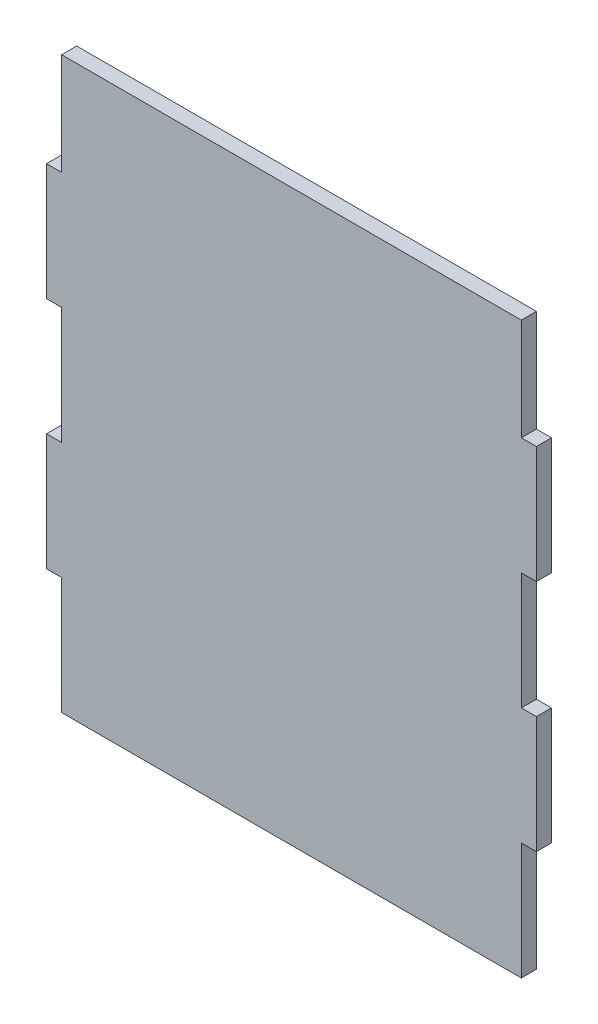
ISO-10303-21;
HEADER;
FILE_DESCRIPTION(('STEP AP214'),'2;1');
FILE_NAME('part.step','',(''),(''),'','','');
FILE_SCHEMA(('AUTOMOTIVE_DESIGN { 1 0 10303 214 1 1 1 1 }'));
ENDSEC;
DATA;
#1=APPLICATION_CONTEXT('core data for automotive mechanical design processes');
#2=APPLICATION_PROTOCOL_DEFINITION('international standard','automotive_design',2000,#1);
#3=PRODUCT_CONTEXT('',#1,'mechanical');
#4=PRODUCT('Part','Part','',(#3));
#5=PRODUCT_RELATED_PRODUCT_CATEGORY('part','',(#4));
#6=PRODUCT_DEFINITION_FORMATION('','',#4);
#7=PRODUCT_DEFINITION_CONTEXT('part definition',#1,'design');
#8=PRODUCT_DEFINITION('design','',#6,#7);
#9=PRODUCT_DEFINITION_SHAPE('','',#8);
#10=(LENGTH_UNIT() NAMED_UNIT(*) SI_UNIT(.MILLI.,.METRE.));
#11=(NAMED_UNIT(*) PLANE_ANGLE_UNIT() SI_UNIT($,.RADIAN.));
#12=(NAMED_UNIT(*) SI_UNIT($,.STERADIAN.) SOLID_ANGLE_UNIT());
#13=UNCERTAINTY_MEASURE_WITH_UNIT(LENGTH_MEASURE(1.E-05),#10,'distance_accuracy_value','');
#14=(GEOMETRIC_REPRESENTATION_CONTEXT(3) GLOBAL_UNCERTAINTY_ASSIGNED_CONTEXT((#13)) GLOBAL_UNIT_ASSIGNED_CONTEXT((#10,
#11,#12)) REPRESENTATION_CONTEXT('',''));
#15=CARTESIAN_POINT('',(0.,0.,0.));
#16=DIRECTION('',(0.,0.,1.));
#17=DIRECTION('',(1.,0.,0.));
#18=AXIS2_PLACEMENT_3D('',#15,#16,#17);
#19=CARTESIAN_POINT('',(-81.825,0.,3.175));
#20=DIRECTION('',(1.,0.,0.));
#21=DIRECTION('',(0.,0.,-1.));
#22=AXIS2_PLACEMENT_3D('',#19,#20,#21);
#23=PLANE('',#22);
#24=DIRECTION('',(0.,-1.,0.));
#25=VECTOR('',#24,1.);
#26=CARTESIAN_POINT('',(-81.825,0.,0.));
#27=LINE('',#26,#25);
#28=CARTESIAN_POINT('',(-81.825,24.635,0.));
#29=VERTEX_POINT('',#28);
#30=CARTESIAN_POINT('',(-81.825,0.,0.));
#31=VERTEX_POINT('',#30);
#32=EDGE_CURVE('E201',#29,#31,#27,.T.);
#33=ORIENTED_EDGE('',*,*,#32,.T.);
#34=DIRECTION('',(0.,0.,-1.));
#35=VECTOR('',#34,1.);
#36=CARTESIAN_POINT('',(-81.825,0.,3.175));
#37=LINE('',#36,#35);
#38=CARTESIAN_POINT('',(-81.825,0.,3.175));
#39=VERTEX_POINT('',#38);
#40=EDGE_CURVE('E11',#39,#31,#37,.T.);
#41=ORIENTED_EDGE('',*,*,#40,.F.);
#42=DIRECTION('',(0.,-1.,0.));
#43=VECTOR('',#42,1.);
#44=CARTESIAN_POINT('',(-81.825,0.,3.175));
#45=LINE('',#44,#43);
#46=CARTESIAN_POINT('',(-81.825,24.635,3.175));
#47=VERTEX_POINT('',#46);
#48=EDGE_CURVE('E239',#47,#39,#45,.T.);
#49=ORIENTED_EDGE('',*,*,#48,.F.);
#50=DIRECTION('',(0.,0.,-1.));
#51=VECTOR('',#50,1.);
#52=CARTESIAN_POINT('',(-81.825,24.635,3.175));
#53=LINE('',#52,#51);
#54=EDGE_CURVE('E197',#47,#29,#53,.T.);
#55=ORIENTED_EDGE('',*,*,#54,.T.);
#56=EDGE_LOOP('',(#33,#41,#49,#55));
#57=FACE_BOUND('',#56,.T.);
#58=ADVANCED_FACE('F33',(#57),#23,.F.);
#59=CARTESIAN_POINT('',(-81.825,0.,3.175));
#60=DIRECTION('',(0.,1.,0.));
#61=DIRECTION('',(0.,0.,1.));
#62=AXIS2_PLACEMENT_3D('',#59,#60,#61);
#63=PLANE('',#62);
#64=DIRECTION('',(1.,0.,0.));
#65=VECTOR('',#64,1.);
#66=CARTESIAN_POINT('',(-81.825,0.,0.));
#67=LINE('',#66,#65);
#68=CARTESIAN_POINT('',(15.,0.,0.));
#69=VERTEX_POINT('',#68);
#70=EDGE_CURVE('E204',#31,#69,#67,.T.);
#71=ORIENTED_EDGE('',*,*,#70,.T.);
#72=DIRECTION('',(0.,0.,-1.));
#73=VECTOR('',#72,1.);
#74=CARTESIAN_POINT('',(15.,0.,3.175));
#75=LINE('',#74,#73);
#76=CARTESIAN_POINT('',(15.,0.,3.175));
#77=VERTEX_POINT('',#76);
#78=EDGE_CURVE('E41',#77,#69,#75,.T.);
#79=ORIENTED_EDGE('',*,*,#78,.F.);
#80=DIRECTION('',(1.,0.,0.));
#81=VECTOR('',#80,1.);
#82=CARTESIAN_POINT('',(-81.825,0.,3.175));
#83=LINE('',#82,#81);
#84=EDGE_CURVE('E128',#39,#77,#83,.T.);
#85=ORIENTED_EDGE('',*,*,#84,.F.);
#86=ORIENTED_EDGE('',*,*,#40,.T.);
#87=EDGE_LOOP('',(#71,#79,#85,#86));
#88=FACE_BOUND('',#87,.T.);
#89=ADVANCED_FACE('F357',(#88),#63,.F.);
#90=CARTESIAN_POINT('',(15.,24.635,3.175));
#91=DIRECTION('',(-1.,0.,0.));
#92=DIRECTION('',(0.,0.,1.));
#93=AXIS2_PLACEMENT_3D('',#90,#91,#92);
#94=PLANE('',#93);
#95=DIRECTION('',(0.,1.,0.));
#96=VECTOR('',#95,1.);
#97=CARTESIAN_POINT('',(15.,24.635,0.));
#98=LINE('',#97,#96);
#99=CARTESIAN_POINT('',(15.,24.635,0.));
#100=VERTEX_POINT('',#99);
#101=EDGE_CURVE('E206',#69,#100,#98,.T.);
#102=ORIENTED_EDGE('',*,*,#101,.T.);
#103=DIRECTION('',(0.,0.,-1.));
#104=VECTOR('',#103,1.);
#105=CARTESIAN_POINT('',(15.,24.635,3.175));
#106=LINE('',#105,#104);
#107=CARTESIAN_POINT('',(15.,24.635,3.175));
#108=VERTEX_POINT('',#107);
#109=EDGE_CURVE('E282',#108,#100,#106,.T.);
#110=ORIENTED_EDGE('',*,*,#109,.F.);
#111=DIRECTION('',(0.,1.,0.));
#112=VECTOR('',#111,1.);
#113=CARTESIAN_POINT('',(15.,24.635,3.175));
#114=LINE('',#113,#112);
#115=EDGE_CURVE('E290',#77,#108,#114,.T.);
#116=ORIENTED_EDGE('',*,*,#115,.F.);
#117=ORIENTED_EDGE('',*,*,#78,.T.);
#118=EDGE_LOOP('',(#102,#110,#116,#117));
#119=FACE_BOUND('',#118,.T.);
#120=ADVANCED_FACE('F288',(#119),#94,.F.);
#121=CARTESIAN_POINT('',(18.175,24.635,3.175));
#122=DIRECTION('',(0.,1.,0.));
#123=DIRECTION('',(-1.,0.,0.));
#124=AXIS2_PLACEMENT_3D('',#121,#122,#123);
#125=PLANE('',#124);
#126=DIRECTION('',(1.,0.,0.));
#127=VECTOR('',#126,1.);
#128=CARTESIAN_POINT('',(18.175,24.635,0.));
#129=LINE('',#128,#127);
#130=CARTESIAN_POINT('',(18.175,24.635,0.));
#131=VERTEX_POINT('',#130);
#132=EDGE_CURVE('E208',#100,#131,#129,.T.);
#133=ORIENTED_EDGE('',*,*,#132,.T.);
#134=DIRECTION('',(0.,0.,-1.));
#135=VECTOR('',#134,1.);
#136=CARTESIAN_POINT('',(18.175,24.635,3.175));
#137=LINE('',#136,#135);
#138=CARTESIAN_POINT('',(18.175,24.635,3.175));
#139=VERTEX_POINT('',#138);
#140=EDGE_CURVE('E279',#139,#131,#137,.T.);
#141=ORIENTED_EDGE('',*,*,#140,.F.);
#142=DIRECTION('',(1.,0.,0.));
#143=VECTOR('',#142,1.);
#144=CARTESIAN_POINT('',(18.175,24.635,3.175));
#145=LINE('',#144,#143);
#146=EDGE_CURVE('E308',#108,#139,#145,.T.);
#147=ORIENTED_EDGE('',*,*,#146,.F.);
#148=ORIENTED_EDGE('',*,*,#109,.T.);
#149=EDGE_LOOP('',(#133,#141,#147,#148));
#150=FACE_BOUND('',#149,.T.);
#151=ADVANCED_FACE('F299',(#150),#125,.F.);
#152=CARTESIAN_POINT('',(18.175,49.27,3.175));
#153=DIRECTION('',(-1.,0.,0.));
#154=DIRECTION('',(0.,0.,1.));
#155=AXIS2_PLACEMENT_3D('',#152,#153,#154);
#156=PLANE('',#155);
#157=DIRECTION('',(0.,1.,0.));
#158=VECTOR('',#157,1.);
#159=CARTESIAN_POINT('',(18.175,49.27,0.));
#160=LINE('',#159,#158);
#161=CARTESIAN_POINT('',(18.175,49.27,0.));
#162=VERTEX_POINT('',#161);
#163=EDGE_CURVE('E210',#131,#162,#160,.T.);
#164=ORIENTED_EDGE('',*,*,#163,.T.);
#165=DIRECTION('',(0.,0.,-1.));
#166=VECTOR('',#165,1.);
#167=CARTESIAN_POINT('',(18.175,49.27,3.175));
#168=LINE('',#167,#166);
#169=CARTESIAN_POINT('',(18.175,49.27,3.175));
#170=VERTEX_POINT('',#169);
#171=EDGE_CURVE('E276',#170,#162,#168,.T.);
#172=ORIENTED_EDGE('',*,*,#171,.F.);
#173=DIRECTION('',(0.,1.,0.));
#174=VECTOR('',#173,1.);
#175=CARTESIAN_POINT('',(18.175,49.27,3.175));
#176=LINE('',#175,#174);
#177=EDGE_CURVE('E305',#139,#170,#176,.T.);
#178=ORIENTED_EDGE('',*,*,#177,.F.);
#179=ORIENTED_EDGE('',*,*,#140,.T.);
#180=EDGE_LOOP('',(#164,#172,#178,#179));
#181=FACE_BOUND('',#180,.T.);
#182=ADVANCED_FACE('F303',(#181),#156,.F.);
#183=CARTESIAN_POINT('',(15.,49.27,3.175));
#184=DIRECTION('',(0.,-1.,0.));
#185=DIRECTION('',(0.,0.,-1.));
#186=AXIS2_PLACEMENT_3D('',#183,#184,#185);
#187=PLANE('',#186);
#188=DIRECTION('',(-1.,0.,0.));
#189=VECTOR('',#188,1.);
#190=CARTESIAN_POINT('',(15.,49.27,0.));
#191=LINE('',#190,#189);
#192=CARTESIAN_POINT('',(15.,49.27,0.));
#193=VERTEX_POINT('',#192);
#194=EDGE_CURVE('E212',#162,#193,#191,.T.);
#195=ORIENTED_EDGE('',*,*,#194,.T.);
#196=DIRECTION('',(0.,0.,-1.));
#197=VECTOR('',#196,1.);
#198=CARTESIAN_POINT('',(15.,49.27,3.175));
#199=LINE('',#198,#197);
#200=CARTESIAN_POINT('',(15.,49.27,3.175));
#201=VERTEX_POINT('',#200);
#202=EDGE_CURVE('E273',#201,#193,#199,.T.);
#203=ORIENTED_EDGE('',*,*,#202,.F.);
#204=DIRECTION('',(-1.,0.,0.));
#205=VECTOR('',#204,1.);
#206=CARTESIAN_POINT('',(15.,49.27,3.175));
#207=LINE('',#206,#205);
#208=EDGE_CURVE('E307',#170,#201,#207,.T.);
#209=ORIENTED_EDGE('',*,*,#208,.F.);
#210=ORIENTED_EDGE('',*,*,#171,.T.);
#211=EDGE_LOOP('',(#195,#203,#209,#210));
#212=FACE_BOUND('',#211,.T.);
#213=ADVANCED_FACE('F370',(#212),#187,.F.);
#214=CARTESIAN_POINT('',(15.,73.905,3.175));
#215=DIRECTION('',(-1.,0.,0.));
#216=DIRECTION('',(0.,0.,1.));
#217=AXIS2_PLACEMENT_3D('',#214,#215,#216);
#218=PLANE('',#217);
#219=DIRECTION('',(0.,1.,0.));
#220=VECTOR('',#219,1.);
#221=CARTESIAN_POINT('',(15.,73.905,0.));
#222=LINE('',#221,#220);
#223=CARTESIAN_POINT('',(15.,73.905,0.));
#224=VERTEX_POINT('',#223);
#225=EDGE_CURVE('E214',#193,#224,#222,.T.);
#226=ORIENTED_EDGE('',*,*,#225,.T.);
#227=DIRECTION('',(0.,0.,-1.));
#228=VECTOR('',#227,1.);
#229=CARTESIAN_POINT('',(15.,73.905,3.175));
#230=LINE('',#229,#228);
#231=CARTESIAN_POINT('',(15.,73.905,3.175));
#232=VERTEX_POINT('',#231);
#233=EDGE_CURVE('E270',#232,#224,#230,.T.);
#234=ORIENTED_EDGE('',*,*,#233,.F.);
#235=DIRECTION('',(0.,1.,0.));
#236=VECTOR('',#235,1.);
#237=CARTESIAN_POINT('',(15.,73.905,3.175));
#238=LINE('',#237,#236);
#239=EDGE_CURVE('E310',#201,#232,#238,.T.);
#240=ORIENTED_EDGE('',*,*,#239,.F.);
#241=ORIENTED_EDGE('',*,*,#202,.T.);
#242=EDGE_LOOP('',(#226,#234,#240,#241));
#243=FACE_BOUND('',#242,.T.);
#244=ADVANCED_FACE('F373',(#243),#218,.F.);
#245=CARTESIAN_POINT('',(18.175,73.905,3.175));
#246=DIRECTION('',(0.,1.,0.));
#247=DIRECTION('',(0.,0.,1.));
#248=AXIS2_PLACEMENT_3D('',#245,#246,#247);
#249=PLANE('',#248);
#250=DIRECTION('',(1.,0.,0.));
#251=VECTOR('',#250,1.);
#252=CARTESIAN_POINT('',(18.175,73.905,0.));
#253=LINE('',#252,#251);
#254=CARTESIAN_POINT('',(18.175,73.905,0.));
#255=VERTEX_POINT('',#254);
#256=EDGE_CURVE('E216',#224,#255,#253,.T.);
#257=ORIENTED_EDGE('',*,*,#256,.T.);
#258=DIRECTION('',(0.,0.,-1.));
#259=VECTOR('',#258,1.);
#260=CARTESIAN_POINT('',(18.175,73.905,3.175));
#261=LINE('',#260,#259);
#262=CARTESIAN_POINT('',(18.175,73.905,3.175));
#263=VERTEX_POINT('',#262);
#264=EDGE_CURVE('E267',#263,#255,#261,.T.);
#265=ORIENTED_EDGE('',*,*,#264,.F.);
#266=DIRECTION('',(1.,0.,0.));
#267=VECTOR('',#266,1.);
#268=CARTESIAN_POINT('',(18.175,73.905,3.175));
#269=LINE('',#268,#267);
#270=EDGE_CURVE('E316',#232,#263,#269,.T.);
#271=ORIENTED_EDGE('',*,*,#270,.F.);
#272=ORIENTED_EDGE('',*,*,#233,.T.);
#273=EDGE_LOOP('',(#257,#265,#271,#272));
#274=FACE_BOUND('',#273,.T.);
#275=ADVANCED_FACE('F377',(#274),#249,.F.);
#276=CARTESIAN_POINT('',(18.175,98.54,3.175));
#277=DIRECTION('',(-1.,0.,0.));
#278=DIRECTION('',(0.,-1.,0.));
#279=AXIS2_PLACEMENT_3D('',#276,#277,#278);
#280=PLANE('',#279);
#281=DIRECTION('',(0.,1.,0.));
#282=VECTOR('',#281,1.);
#283=CARTESIAN_POINT('',(18.175,98.54,0.));
#284=LINE('',#283,#282);
#285=CARTESIAN_POINT('',(18.175,98.54,0.));
#286=VERTEX_POINT('',#285);
#287=EDGE_CURVE('E218',#255,#286,#284,.T.);
#288=ORIENTED_EDGE('',*,*,#287,.T.);
#289=DIRECTION('',(0.,0.,-1.));
#290=VECTOR('',#289,1.);
#291=CARTESIAN_POINT('',(18.175,98.54,3.175));
#292=LINE('',#291,#290);
#293=CARTESIAN_POINT('',(18.175,98.54,3.175));
#294=VERTEX_POINT('',#293);
#295=EDGE_CURVE('E264',#294,#286,#292,.T.);
#296=ORIENTED_EDGE('',*,*,#295,.F.);
#297=DIRECTION('',(0.,1.,0.));
#298=VECTOR('',#297,1.);
#299=CARTESIAN_POINT('',(18.175,98.54,3.175));
#300=LINE('',#299,#298);
#301=EDGE_CURVE('E318',#263,#294,#300,.T.);
#302=ORIENTED_EDGE('',*,*,#301,.F.);
#303=ORIENTED_EDGE('',*,*,#264,.T.);
#304=EDGE_LOOP('',(#288,#296,#302,#303));
#305=FACE_BOUND('',#304,.T.);
#306=ADVANCED_FACE('F381',(#305),#280,.F.);
#307=CARTESIAN_POINT('',(15.,98.54,3.175));
#308=DIRECTION('',(0.,-1.,0.));
#309=DIRECTION('',(1.,0.,0.));
#310=AXIS2_PLACEMENT_3D('',#307,#308,#309);
#311=PLANE('',#310);
#312=DIRECTION('',(-1.,0.,0.));
#313=VECTOR('',#312,1.);
#314=CARTESIAN_POINT('',(15.,98.54,0.));
#315=LINE('',#314,#313);
#316=CARTESIAN_POINT('',(15.,98.54,0.));
#317=VERTEX_POINT('',#316);
#318=EDGE_CURVE('E220',#286,#317,#315,.T.);
#319=ORIENTED_EDGE('',*,*,#318,.T.);
#320=DIRECTION('',(0.,0.,-1.));
#321=VECTOR('',#320,1.);
#322=CARTESIAN_POINT('',(15.,98.54,3.175));
#323=LINE('',#322,#321);
#324=CARTESIAN_POINT('',(15.,98.54,3.175));
#325=VERTEX_POINT('',#324);
#326=EDGE_CURVE('E261',#325,#317,#323,.T.);
#327=ORIENTED_EDGE('',*,*,#326,.F.);
#328=DIRECTION('',(-1.,0.,0.));
#329=VECTOR('',#328,1.);
#330=CARTESIAN_POINT('',(15.,98.54,3.175));
#331=LINE('',#330,#329);
#332=EDGE_CURVE('E320',#294,#325,#331,.T.);
#333=ORIENTED_EDGE('',*,*,#332,.F.);
#334=ORIENTED_EDGE('',*,*,#295,.T.);
#335=EDGE_LOOP('',(#319,#327,#333,#334));
#336=FACE_BOUND('',#335,.T.);
#337=ADVANCED_FACE('F385',(#336),#311,.F.);
#338=CARTESIAN_POINT('',(15.,120.,3.175));
#339=DIRECTION('',(-1.,0.,0.));
#340=DIRECTION('',(0.,0.,1.));
#341=AXIS2_PLACEMENT_3D('',#338,#339,#340);
#342=PLANE('',#341);
#343=DIRECTION('',(0.,1.,0.));
#344=VECTOR('',#343,1.);
#345=CARTESIAN_POINT('',(15.,120.,0.));
#346=LINE('',#345,#344);
#347=CARTESIAN_POINT('',(15.,120.,0.));
#348=VERTEX_POINT('',#347);
#349=EDGE_CURVE('E222',#317,#348,#346,.T.);
#350=ORIENTED_EDGE('',*,*,#349,.T.);
#351=DIRECTION('',(0.,0.,-1.));
#352=VECTOR('',#351,1.);
#353=CARTESIAN_POINT('',(15.,120.,3.175));
#354=LINE('',#353,#352);
#355=CARTESIAN_POINT('',(15.,120.,3.175));
#356=VERTEX_POINT('',#355);
#357=EDGE_CURVE('E258',#356,#348,#354,.T.);
#358=ORIENTED_EDGE('',*,*,#357,.F.);
#359=DIRECTION('',(0.,1.,0.));
#360=VECTOR('',#359,1.);
#361=CARTESIAN_POINT('',(15.,120.,3.175));
#362=LINE('',#361,#360);
#363=EDGE_CURVE('E322',#325,#356,#362,.T.);
#364=ORIENTED_EDGE('',*,*,#363,.F.);
#365=ORIENTED_EDGE('',*,*,#326,.T.);
#366=EDGE_LOOP('',(#350,#358,#364,#365));
#367=FACE_BOUND('',#366,.T.);
#368=ADVANCED_FACE('F389',(#367),#342,.F.);
#369=CARTESIAN_POINT('',(-81.825,120.,3.175));
#370=DIRECTION('',(0.,-1.,0.));
#371=DIRECTION('',(0.,0.,-1.));
#372=AXIS2_PLACEMENT_3D('',#369,#370,#371);
#373=PLANE('',#372);
#374=DIRECTION('',(-1.,0.,0.));
#375=VECTOR('',#374,1.);
#376=CARTESIAN_POINT('',(-81.825,120.,0.));
#377=LINE('',#376,#375);
#378=CARTESIAN_POINT('',(-81.825,120.,0.));
#379=VERTEX_POINT('',#378);
#380=EDGE_CURVE('E224',#348,#379,#377,.T.);
#381=ORIENTED_EDGE('',*,*,#380,.T.);
#382=DIRECTION('',(0.,0.,-1.));
#383=VECTOR('',#382,1.);
#384=CARTESIAN_POINT('',(-81.825,120.,3.175));
#385=LINE('',#384,#383);
#386=CARTESIAN_POINT('',(-81.825,120.,3.175));
#387=VERTEX_POINT('',#386);
#388=EDGE_CURVE('E255',#387,#379,#385,.T.);
#389=ORIENTED_EDGE('',*,*,#388,.F.);
#390=DIRECTION('',(-1.,0.,0.));
#391=VECTOR('',#390,1.);
#392=CARTESIAN_POINT('',(-81.825,120.,3.175));
#393=LINE('',#392,#391);
#394=EDGE_CURVE('E324',#356,#387,#393,.T.);
#395=ORIENTED_EDGE('',*,*,#394,.F.);
#396=ORIENTED_EDGE('',*,*,#357,.T.);
#397=EDGE_LOOP('',(#381,#389,#395,#396));
#398=FACE_BOUND('',#397,.T.);
#399=ADVANCED_FACE('F393',(#398),#373,.F.);
#400=CARTESIAN_POINT('',(-81.825,98.54,3.175));
#401=DIRECTION('',(1.,0.,0.));
#402=DIRECTION('',(0.,0.,-1.));
#403=AXIS2_PLACEMENT_3D('',#400,#401,#402);
#404=PLANE('',#403);
#405=DIRECTION('',(0.,-1.,0.));
#406=VECTOR('',#405,1.);
#407=CARTESIAN_POINT('',(-81.825,98.54,0.));
#408=LINE('',#407,#406);
#409=CARTESIAN_POINT('',(-81.825,98.54,0.));
#410=VERTEX_POINT('',#409);
#411=EDGE_CURVE('E226',#379,#410,#408,.T.);
#412=ORIENTED_EDGE('',*,*,#411,.T.);
#413=DIRECTION('',(0.,0.,-1.));
#414=VECTOR('',#413,1.);
#415=CARTESIAN_POINT('',(-81.825,98.54,3.175));
#416=LINE('',#415,#414);
#417=CARTESIAN_POINT('',(-81.825,98.54,3.175));
#418=VERTEX_POINT('',#417);
#419=EDGE_CURVE('E252',#418,#410,#416,.T.);
#420=ORIENTED_EDGE('',*,*,#419,.F.);
#421=DIRECTION('',(0.,-1.,0.));
#422=VECTOR('',#421,1.);
#423=CARTESIAN_POINT('',(-81.825,98.54,3.175));
#424=LINE('',#423,#422);
#425=EDGE_CURVE('E326',#387,#418,#424,.T.);
#426=ORIENTED_EDGE('',*,*,#425,.F.);
#427=ORIENTED_EDGE('',*,*,#388,.T.);
#428=EDGE_LOOP('',(#412,#420,#426,#427));
#429=FACE_BOUND('',#428,.T.);
#430=ADVANCED_FACE('F397',(#429),#404,.F.);
#431=CARTESIAN_POINT('',(-81.825,98.54,3.175));
#432=DIRECTION('',(0.,-1.,0.));
#433=DIRECTION('',(1.,0.,0.));
#434=AXIS2_PLACEMENT_3D('',#431,#432,#433);
#435=PLANE('',#434);
#436=DIRECTION('',(-1.,0.,0.));
#437=VECTOR('',#436,1.);
#438=CARTESIAN_POINT('',(-81.825,98.54,0.));
#439=LINE('',#438,#437);
#440=CARTESIAN_POINT('',(-85.,98.54,0.));
#441=VERTEX_POINT('',#440);
#442=EDGE_CURVE('E228',#410,#441,#439,.T.);
#443=ORIENTED_EDGE('',*,*,#442,.T.);
#444=DIRECTION('',(0.,0.,-1.));
#445=VECTOR('',#444,1.);
#446=CARTESIAN_POINT('',(-85.,98.54,3.175));
#447=LINE('',#446,#445);
#448=CARTESIAN_POINT('',(-85.,98.54,3.175));
#449=VERTEX_POINT('',#448);
#450=EDGE_CURVE('E249',#449,#441,#447,.T.);
#451=ORIENTED_EDGE('',*,*,#450,.F.);
#452=DIRECTION('',(-1.,0.,0.));
#453=VECTOR('',#452,1.);
#454=CARTESIAN_POINT('',(-81.825,98.54,3.175));
#455=LINE('',#454,#453);
#456=EDGE_CURVE('E328',#418,#449,#455,.T.);
#457=ORIENTED_EDGE('',*,*,#456,.F.);
#458=ORIENTED_EDGE('',*,*,#419,.T.);
#459=EDGE_LOOP('',(#443,#451,#457,#458));
#460=FACE_BOUND('',#459,.T.);
#461=ADVANCED_FACE('F401',(#460),#435,.F.);
#462=CARTESIAN_POINT('',(-85.,98.54,3.175));
#463=DIRECTION('',(1.,0.,0.));
#464=DIRECTION('',(0.,1.,0.));
#465=AXIS2_PLACEMENT_3D('',#462,#463,#464);
#466=PLANE('',#465);
#467=DIRECTION('',(0.,-1.,0.));
#468=VECTOR('',#467,1.);
#469=CARTESIAN_POINT('',(-85.,98.54,0.));
#470=LINE('',#469,#468);
#471=CARTESIAN_POINT('',(-85.,73.905,0.));
#472=VERTEX_POINT('',#471);
#473=EDGE_CURVE('E230',#441,#472,#470,.T.);
#474=ORIENTED_EDGE('',*,*,#473,.T.);
#475=DIRECTION('',(0.,0.,-1.));
#476=VECTOR('',#475,1.);
#477=CARTESIAN_POINT('',(-85.,73.905,3.175));
#478=LINE('',#477,#476);
#479=CARTESIAN_POINT('',(-85.,73.905,3.175));
#480=VERTEX_POINT('',#479);
#481=EDGE_CURVE('E246',#480,#472,#478,.T.);
#482=ORIENTED_EDGE('',*,*,#481,.F.);
#483=DIRECTION('',(0.,-1.,0.));
#484=VECTOR('',#483,1.);
#485=CARTESIAN_POINT('',(-85.,98.54,3.175));
#486=LINE('',#485,#484);
#487=EDGE_CURVE('E330',#449,#480,#486,.T.);
#488=ORIENTED_EDGE('',*,*,#487,.F.);
#489=ORIENTED_EDGE('',*,*,#450,.T.);
#490=EDGE_LOOP('',(#474,#482,#488,#489));
#491=FACE_BOUND('',#490,.T.);
#492=ADVANCED_FACE('F405',(#491),#466,.F.);
#493=CARTESIAN_POINT('',(-85.,73.905,3.175));
#494=DIRECTION('',(0.,1.,0.));
#495=DIRECTION('',(0.,0.,1.));
#496=AXIS2_PLACEMENT_3D('',#493,#494,#495);
#497=PLANE('',#496);
#498=DIRECTION('',(1.,0.,0.));
#499=VECTOR('',#498,1.);
#500=CARTESIAN_POINT('',(-85.,73.905,0.));
#501=LINE('',#500,#499);
#502=CARTESIAN_POINT('',(-81.825,73.905,0.));
#503=VERTEX_POINT('',#502);
#504=EDGE_CURVE('E232',#472,#503,#501,.T.);
#505=ORIENTED_EDGE('',*,*,#504,.T.);
#506=DIRECTION('',(0.,0.,-1.));
#507=VECTOR('',#506,1.);
#508=CARTESIAN_POINT('',(-81.825,73.905,3.175));
#509=LINE('',#508,#507);
#510=CARTESIAN_POINT('',(-81.825,73.905,3.175));
#511=VERTEX_POINT('',#510);
#512=EDGE_CURVE('E243',#511,#503,#509,.T.);
#513=ORIENTED_EDGE('',*,*,#512,.F.);
#514=DIRECTION('',(1.,0.,0.));
#515=VECTOR('',#514,1.);
#516=CARTESIAN_POINT('',(-85.,73.905,3.175));
#517=LINE('',#516,#515);
#518=EDGE_CURVE('E332',#480,#511,#517,.T.);
#519=ORIENTED_EDGE('',*,*,#518,.F.);
#520=ORIENTED_EDGE('',*,*,#481,.T.);
#521=EDGE_LOOP('',(#505,#513,#519,#520));
#522=FACE_BOUND('',#521,.T.);
#523=ADVANCED_FACE('F338',(#522),#497,.F.);
#524=CARTESIAN_POINT('',(-81.825,49.27,3.175));
#525=DIRECTION('',(1.,0.,0.));
#526=DIRECTION('',(0.,0.,-1.));
#527=AXIS2_PLACEMENT_3D('',#524,#525,#526);
#528=PLANE('',#527);
#529=DIRECTION('',(0.,-1.,0.));
#530=VECTOR('',#529,1.);
#531=CARTESIAN_POINT('',(-81.825,49.27,0.));
#532=LINE('',#531,#530);
#533=CARTESIAN_POINT('',(-81.825,49.27,0.));
#534=VERTEX_POINT('',#533);
#535=EDGE_CURVE('E234',#503,#534,#532,.T.);
#536=ORIENTED_EDGE('',*,*,#535,.T.);
#537=DIRECTION('',(0.,0.,-1.));
#538=VECTOR('',#537,1.);
#539=CARTESIAN_POINT('',(-81.825,49.27,3.175));
#540=LINE('',#539,#538);
#541=CARTESIAN_POINT('',(-81.825,49.27,3.175));
#542=VERTEX_POINT('',#541);
#543=EDGE_CURVE('E192',#542,#534,#540,.T.);
#544=ORIENTED_EDGE('',*,*,#543,.F.);
#545=DIRECTION('',(0.,-1.,0.));
#546=VECTOR('',#545,1.);
#547=CARTESIAN_POINT('',(-81.825,49.27,3.175));
#548=LINE('',#547,#546);
#549=EDGE_CURVE('E183',#511,#542,#548,.T.);
#550=ORIENTED_EDGE('',*,*,#549,.F.);
#551=ORIENTED_EDGE('',*,*,#512,.T.);
#552=EDGE_LOOP('',(#536,#544,#550,#551));
#553=FACE_BOUND('',#552,.T.);
#554=ADVANCED_FACE('F342',(#553),#528,.F.);
#555=CARTESIAN_POINT('',(-81.825,49.27,3.175));
#556=DIRECTION('',(0.,-1.,0.));
#557=DIRECTION('',(0.,0.,-1.));
#558=AXIS2_PLACEMENT_3D('',#555,#556,#557);
#559=PLANE('',#558);
#560=DIRECTION('',(-1.,0.,0.));
#561=VECTOR('',#560,1.);
#562=CARTESIAN_POINT('',(-81.825,49.27,0.));
#563=LINE('',#562,#561);
#564=CARTESIAN_POINT('',(-85.,49.27,0.));
#565=VERTEX_POINT('',#564);
#566=EDGE_CURVE('E191',#534,#565,#563,.T.);
#567=ORIENTED_EDGE('',*,*,#566,.T.);
#568=DIRECTION('',(0.,0.,-1.));
#569=VECTOR('',#568,1.);
#570=CARTESIAN_POINT('',(-85.,49.27,3.175));
#571=LINE('',#570,#569);
#572=CARTESIAN_POINT('',(-85.,49.27,3.175));
#573=VERTEX_POINT('',#572);
#574=EDGE_CURVE('E188',#573,#565,#571,.T.);
#575=ORIENTED_EDGE('',*,*,#574,.F.);
#576=DIRECTION('',(-1.,0.,0.));
#577=VECTOR('',#576,1.);
#578=CARTESIAN_POINT('',(-81.825,49.27,3.175));
#579=LINE('',#578,#577);
#580=EDGE_CURVE('E177',#542,#573,#579,.T.);
#581=ORIENTED_EDGE('',*,*,#580,.F.);
#582=ORIENTED_EDGE('',*,*,#543,.T.);
#583=EDGE_LOOP('',(#567,#575,#581,#582));
#584=FACE_BOUND('',#583,.T.);
#585=ADVANCED_FACE('F189',(#584),#559,.F.);
#586=CARTESIAN_POINT('',(-85.,49.27,3.175));
#587=DIRECTION('',(1.,0.,0.));
#588=DIRECTION('',(0.,0.,-1.));
#589=AXIS2_PLACEMENT_3D('',#586,#587,#588);
#590=PLANE('',#589);
#591=DIRECTION('',(0.,-1.,0.));
#592=VECTOR('',#591,1.);
#593=CARTESIAN_POINT('',(-85.,49.27,0.));
#594=LINE('',#593,#592);
#595=CARTESIAN_POINT('',(-85.,24.635,0.));
#596=VERTEX_POINT('',#595);
#597=EDGE_CURVE('E114',#565,#596,#594,.T.);
#598=ORIENTED_EDGE('',*,*,#597,.T.);
#599=DIRECTION('',(0.,0.,-1.));
#600=VECTOR('',#599,1.);
#601=CARTESIAN_POINT('',(-85.,24.635,3.175));
#602=LINE('',#601,#600);
#603=CARTESIAN_POINT('',(-85.,24.635,3.175));
#604=VERTEX_POINT('',#603);
#605=EDGE_CURVE('E193',#604,#596,#602,.T.);
#606=ORIENTED_EDGE('',*,*,#605,.F.);
#607=DIRECTION('',(0.,-1.,0.));
#608=VECTOR('',#607,1.);
#609=CARTESIAN_POINT('',(-85.,49.27,3.175));
#610=LINE('',#609,#608);
#611=EDGE_CURVE('E181',#573,#604,#610,.T.);
#612=ORIENTED_EDGE('',*,*,#611,.F.);
#613=ORIENTED_EDGE('',*,*,#574,.T.);
#614=EDGE_LOOP('',(#598,#606,#612,#613));
#615=FACE_BOUND('',#614,.T.);
#616=ADVANCED_FACE('F195',(#615),#590,.F.);
#617=CARTESIAN_POINT('',(-85.,24.635,3.175));
#618=DIRECTION('',(0.,1.,0.));
#619=DIRECTION('',(-1.,0.,0.));
#620=AXIS2_PLACEMENT_3D('',#617,#618,#619);
#621=PLANE('',#620);
#622=DIRECTION('',(1.,0.,0.));
#623=VECTOR('',#622,1.);
#624=CARTESIAN_POINT('',(-85.,24.635,0.));
#625=LINE('',#624,#623);
#626=EDGE_CURVE('E120',#596,#29,#625,.T.);
#627=ORIENTED_EDGE('',*,*,#626,.T.);
#628=ORIENTED_EDGE('',*,*,#54,.F.);
#629=DIRECTION('',(1.,0.,0.));
#630=VECTOR('',#629,1.);
#631=CARTESIAN_POINT('',(-85.,24.635,3.175));
#632=LINE('',#631,#630);
#633=EDGE_CURVE('E49',#604,#47,#632,.T.);
#634=ORIENTED_EDGE('',*,*,#633,.F.);
#635=ORIENTED_EDGE('',*,*,#605,.T.);
#636=EDGE_LOOP('',(#627,#628,#634,#635));
#637=FACE_BOUND('',#636,.T.);
#638=ADVANCED_FACE('F346',(#637),#621,.F.);
#639=CARTESIAN_POINT('',(0.,0.,3.175));
#640=DIRECTION('',(0.,0.,-1.));
#641=DIRECTION('',(-1.,0.,0.));
#642=AXIS2_PLACEMENT_3D('',#639,#640,#641);
#643=PLANE('',#642);
#644=ORIENTED_EDGE('',*,*,#48,.T.);
#645=ORIENTED_EDGE('',*,*,#84,.T.);
#646=ORIENTED_EDGE('',*,*,#115,.T.);
#647=ORIENTED_EDGE('',*,*,#146,.T.);
#648=ORIENTED_EDGE('',*,*,#177,.T.);
#649=ORIENTED_EDGE('',*,*,#208,.T.);
#650=ORIENTED_EDGE('',*,*,#239,.T.);
#651=ORIENTED_EDGE('',*,*,#270,.T.);
#652=ORIENTED_EDGE('',*,*,#301,.T.);
#653=ORIENTED_EDGE('',*,*,#332,.T.);
#654=ORIENTED_EDGE('',*,*,#363,.T.);
#655=ORIENTED_EDGE('',*,*,#394,.T.);
#656=ORIENTED_EDGE('',*,*,#425,.T.);
#657=ORIENTED_EDGE('',*,*,#456,.T.);
#658=ORIENTED_EDGE('',*,*,#487,.T.);
#659=ORIENTED_EDGE('',*,*,#518,.T.);
#660=ORIENTED_EDGE('',*,*,#549,.T.);
#661=ORIENTED_EDGE('',*,*,#580,.T.);
#662=ORIENTED_EDGE('',*,*,#611,.T.);
#663=ORIENTED_EDGE('',*,*,#633,.T.);
#664=EDGE_LOOP('',(#644,#645,#646,#647,#648,#649,#650,#651,#652,#653,#654,#655,#656,#657,#658,
#659,#660,#661,#662,#663));
#665=FACE_BOUND('',#664,.T.);
#666=ADVANCED_FACE('F179',(#665),#643,.F.);
#667=CARTESIAN_POINT('',(0.,0.,0.));
#668=DIRECTION('',(0.,0.,-1.));
#669=DIRECTION('',(-1.,0.,0.));
#670=AXIS2_PLACEMENT_3D('',#667,#668,#669);
#671=PLANE('',#670);
#672=ORIENTED_EDGE('',*,*,#32,.F.);
#673=ORIENTED_EDGE('',*,*,#626,.F.);
#674=ORIENTED_EDGE('',*,*,#597,.F.);
#675=ORIENTED_EDGE('',*,*,#566,.F.);
#676=ORIENTED_EDGE('',*,*,#535,.F.);
#677=ORIENTED_EDGE('',*,*,#504,.F.);
#678=ORIENTED_EDGE('',*,*,#473,.F.);
#679=ORIENTED_EDGE('',*,*,#442,.F.);
#680=ORIENTED_EDGE('',*,*,#411,.F.);
#681=ORIENTED_EDGE('',*,*,#380,.F.);
#682=ORIENTED_EDGE('',*,*,#349,.F.);
#683=ORIENTED_EDGE('',*,*,#318,.F.);
#684=ORIENTED_EDGE('',*,*,#287,.F.);
#685=ORIENTED_EDGE('',*,*,#256,.F.);
#686=ORIENTED_EDGE('',*,*,#225,.F.);
#687=ORIENTED_EDGE('',*,*,#194,.F.);
#688=ORIENTED_EDGE('',*,*,#163,.F.);
#689=ORIENTED_EDGE('',*,*,#132,.F.);
#690=ORIENTED_EDGE('',*,*,#101,.F.);
#691=ORIENTED_EDGE('',*,*,#70,.F.);
#692=EDGE_LOOP('',(#672,#673,#674,#675,#676,#677,#678,#679,#680,#681,#682,#683,#684,#685,#686,
#687,#688,#689,#690,#691));
#693=FACE_BOUND('',#692,.T.);
#694=ADVANCED_FACE('F294',(#693),#671,.T.);
#695=CLOSED_SHELL('',(#58,#89,#120,#151,#182,#213,#244,#275,#306,#337,#368,#399,#430,#461,#492,
#523,#554,#585,#616,#638,#666,#694));
#696=MANIFOLD_SOLID_BREP('B2',#695);
#697=ADVANCED_BREP_SHAPE_REPRESENTATION('',(#18,#696),#14);
#698=SHAPE_DEFINITION_REPRESENTATION(#9,#697);
ENDSEC;
END-ISO-10303-21;
